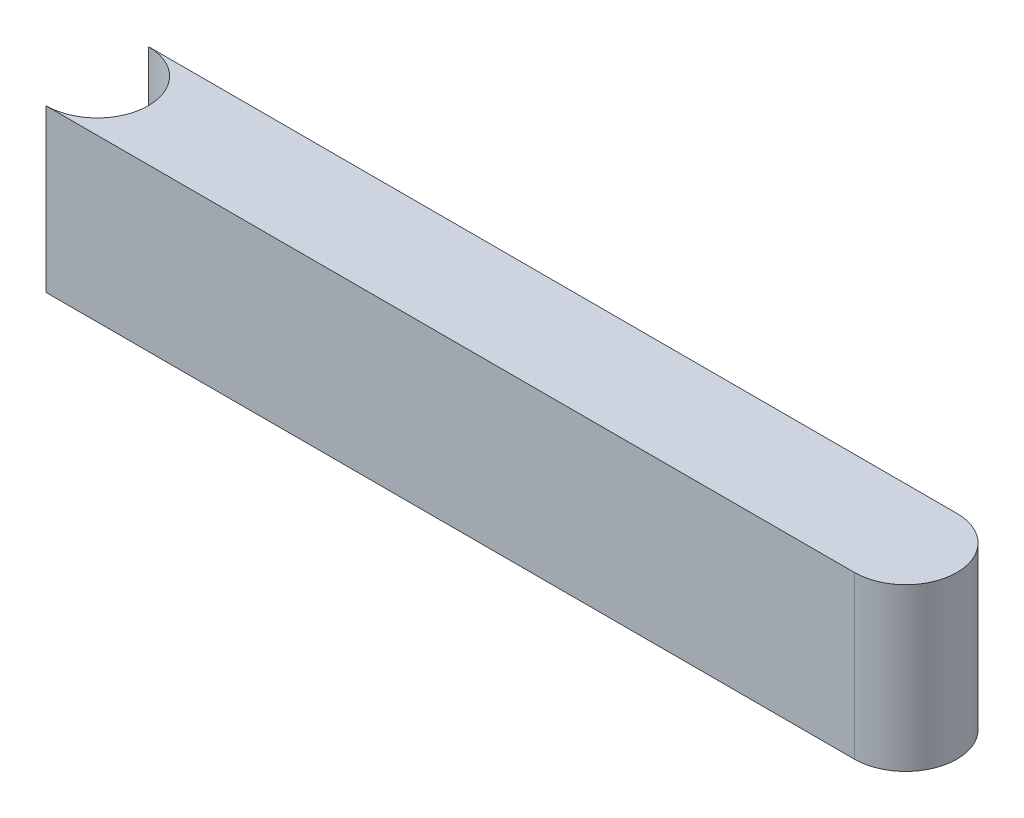
ISO-10303-21;
HEADER;
FILE_DESCRIPTION(('STEP AP214'),'2;1');
FILE_NAME('part.step','',(''),(''),'','','');
FILE_SCHEMA(('AUTOMOTIVE_DESIGN { 1 0 10303 214 1 1 1 1 }'));
ENDSEC;
DATA;
#1=APPLICATION_CONTEXT('core data for automotive mechanical design processes');
#2=APPLICATION_PROTOCOL_DEFINITION('international standard','automotive_design',2000,#1);
#3=PRODUCT_CONTEXT('',#1,'mechanical');
#4=PRODUCT('Part','Part','',(#3));
#5=PRODUCT_RELATED_PRODUCT_CATEGORY('part','',(#4));
#6=PRODUCT_DEFINITION_FORMATION('','',#4);
#7=PRODUCT_DEFINITION_CONTEXT('part definition',#1,'design');
#8=PRODUCT_DEFINITION('design','',#6,#7);
#9=PRODUCT_DEFINITION_SHAPE('','',#8);
#10=(LENGTH_UNIT() NAMED_UNIT(*) SI_UNIT(.MILLI.,.METRE.));
#11=(NAMED_UNIT(*) PLANE_ANGLE_UNIT() SI_UNIT($,.RADIAN.));
#12=(NAMED_UNIT(*) SI_UNIT($,.STERADIAN.) SOLID_ANGLE_UNIT());
#13=UNCERTAINTY_MEASURE_WITH_UNIT(LENGTH_MEASURE(1.E-05),#10,'distance_accuracy_value','');
#14=(GEOMETRIC_REPRESENTATION_CONTEXT(3) GLOBAL_UNCERTAINTY_ASSIGNED_CONTEXT((#13)) GLOBAL_UNIT_ASSIGNED_CONTEXT((#10,
#11,#12)) REPRESENTATION_CONTEXT('',''));
#15=CARTESIAN_POINT('',(0.,0.,0.));
#16=DIRECTION('',(0.,0.,1.));
#17=DIRECTION('',(1.,0.,0.));
#18=AXIS2_PLACEMENT_3D('',#15,#16,#17);
#19=CARTESIAN_POINT('',(0.,30.,9.5));
#20=DIRECTION('',(0.,-1.,0.));
#21=DIRECTION('',(0.,0.,-1.));
#22=AXIS2_PLACEMENT_3D('',#19,#20,#21);
#23=CYLINDRICAL_SURFACE('',#22,9.5);
#24=CARTESIAN_POINT('',(0.,0.,9.5));
#25=DIRECTION('',(0.,-1.,0.));
#26=DIRECTION('',(0.,0.,1.));
#27=AXIS2_PLACEMENT_3D('',#24,#25,#26);
#28=CIRCLE('',#27,9.5);
#29=CARTESIAN_POINT('',(0.,0.,0.));
#30=VERTEX_POINT('',#29);
#31=CARTESIAN_POINT('',(0.,0.,19.));
#32=VERTEX_POINT('',#31);
#33=EDGE_CURVE('E107',#30,#32,#28,.T.);
#34=ORIENTED_EDGE('',*,*,#33,.T.);
#35=DIRECTION('',(0.,-1.,0.));
#36=VECTOR('',#35,1.);
#37=CARTESIAN_POINT('',(0.,30.,19.));
#38=LINE('',#37,#36);
#39=CARTESIAN_POINT('',(0.,30.,19.));
#40=VERTEX_POINT('',#39);
#41=EDGE_CURVE('E11',#40,#32,#38,.T.);
#42=ORIENTED_EDGE('',*,*,#41,.F.);
#43=CARTESIAN_POINT('',(0.,30.,9.5));
#44=DIRECTION('',(0.,-1.,0.));
#45=DIRECTION('',(0.,0.,1.));
#46=AXIS2_PLACEMENT_3D('',#43,#44,#45);
#47=CIRCLE('',#46,9.5);
#48=CARTESIAN_POINT('',(0.,30.,0.));
#49=VERTEX_POINT('',#48);
#50=EDGE_CURVE('E91',#49,#40,#47,.T.);
#51=ORIENTED_EDGE('',*,*,#50,.F.);
#52=DIRECTION('',(0.,-1.,0.));
#53=VECTOR('',#52,1.);
#54=CARTESIAN_POINT('',(0.,30.,0.));
#55=LINE('',#54,#53);
#56=EDGE_CURVE('E103',#49,#30,#55,.T.);
#57=ORIENTED_EDGE('',*,*,#56,.T.);
#58=EDGE_LOOP('',(#34,#42,#51,#57));
#59=FACE_BOUND('',#58,.T.);
#60=ADVANCED_FACE('F39',(#59),#23,.F.);
#61=CARTESIAN_POINT('',(150.,30.,19.));
#62=DIRECTION('',(0.,0.,-1.));
#63=DIRECTION('',(-1.,0.,0.));
#64=AXIS2_PLACEMENT_3D('',#61,#62,#63);
#65=PLANE('',#64);
#66=DIRECTION('',(1.,0.,0.));
#67=VECTOR('',#66,1.);
#68=CARTESIAN_POINT('',(150.,0.,19.));
#69=LINE('',#68,#67);
#70=CARTESIAN_POINT('',(150.,0.,19.));
#71=VERTEX_POINT('',#70);
#72=EDGE_CURVE('E96',#32,#71,#69,.T.);
#73=ORIENTED_EDGE('',*,*,#72,.T.);
#74=DIRECTION('',(0.,-1.,0.));
#75=VECTOR('',#74,1.);
#76=CARTESIAN_POINT('',(150.,30.,19.));
#77=LINE('',#76,#75);
#78=CARTESIAN_POINT('',(150.,30.,19.));
#79=VERTEX_POINT('',#78);
#80=EDGE_CURVE('E48',#79,#71,#77,.T.);
#81=ORIENTED_EDGE('',*,*,#80,.F.);
#82=DIRECTION('',(1.,0.,0.));
#83=VECTOR('',#82,1.);
#84=CARTESIAN_POINT('',(150.,30.,19.));
#85=LINE('',#84,#83);
#86=EDGE_CURVE('E86',#40,#79,#85,.T.);
#87=ORIENTED_EDGE('',*,*,#86,.F.);
#88=ORIENTED_EDGE('',*,*,#41,.T.);
#89=EDGE_LOOP('',(#73,#81,#87,#88));
#90=FACE_BOUND('',#89,.T.);
#91=ADVANCED_FACE('F95',(#90),#65,.F.);
#92=CARTESIAN_POINT('',(150.,30.,9.5));
#93=DIRECTION('',(0.,-1.,0.));
#94=DIRECTION('',(0.,0.,-1.));
#95=AXIS2_PLACEMENT_3D('',#92,#93,#94);
#96=CYLINDRICAL_SURFACE('',#95,9.5);
#97=CARTESIAN_POINT('',(150.,0.,9.5));
#98=DIRECTION('',(0.,1.,0.));
#99=DIRECTION('',(0.,0.,-1.));
#100=AXIS2_PLACEMENT_3D('',#97,#98,#99);
#101=CIRCLE('',#100,9.5);
#102=CARTESIAN_POINT('',(150.,0.,0.));
#103=VERTEX_POINT('',#102);
#104=EDGE_CURVE('E73',#71,#103,#101,.T.);
#105=ORIENTED_EDGE('',*,*,#104,.T.);
#106=DIRECTION('',(0.,-1.,0.));
#107=VECTOR('',#106,1.);
#108=CARTESIAN_POINT('',(150.,30.,0.));
#109=LINE('',#108,#107);
#110=CARTESIAN_POINT('',(150.,30.,0.));
#111=VERTEX_POINT('',#110);
#112=EDGE_CURVE('E98',#111,#103,#109,.T.);
#113=ORIENTED_EDGE('',*,*,#112,.F.);
#114=CARTESIAN_POINT('',(150.,30.,9.5));
#115=DIRECTION('',(0.,1.,0.));
#116=DIRECTION('',(0.,0.,-1.));
#117=AXIS2_PLACEMENT_3D('',#114,#115,#116);
#118=CIRCLE('',#117,9.5);
#119=EDGE_CURVE('E89',#79,#111,#118,.T.);
#120=ORIENTED_EDGE('',*,*,#119,.F.);
#121=ORIENTED_EDGE('',*,*,#80,.T.);
#122=EDGE_LOOP('',(#105,#113,#120,#121));
#123=FACE_BOUND('',#122,.T.);
#124=ADVANCED_FACE('F99',(#123),#96,.T.);
#125=CARTESIAN_POINT('',(0.,30.,0.));
#126=DIRECTION('',(0.,0.,1.));
#127=DIRECTION('',(1.,0.,0.));
#128=AXIS2_PLACEMENT_3D('',#125,#126,#127);
#129=PLANE('',#128);
#130=DIRECTION('',(-1.,0.,0.));
#131=VECTOR('',#130,1.);
#132=CARTESIAN_POINT('',(0.,0.,0.));
#133=LINE('',#132,#131);
#134=EDGE_CURVE('E79',#103,#30,#133,.T.);
#135=ORIENTED_EDGE('',*,*,#134,.T.);
#136=ORIENTED_EDGE('',*,*,#56,.F.);
#137=DIRECTION('',(-1.,0.,0.));
#138=VECTOR('',#137,1.);
#139=CARTESIAN_POINT('',(0.,30.,0.));
#140=LINE('',#139,#138);
#141=EDGE_CURVE('E56',#111,#49,#140,.T.);
#142=ORIENTED_EDGE('',*,*,#141,.F.);
#143=ORIENTED_EDGE('',*,*,#112,.T.);
#144=EDGE_LOOP('',(#135,#136,#142,#143));
#145=FACE_BOUND('',#144,.T.);
#146=ADVANCED_FACE('F120',(#145),#129,.F.);
#147=CARTESIAN_POINT('',(0.,30.,9.5));
#148=DIRECTION('',(0.,1.,0.));
#149=DIRECTION('',(0.,0.,1.));
#150=AXIS2_PLACEMENT_3D('',#147,#148,#149);
#151=PLANE('',#150);
#152=ORIENTED_EDGE('',*,*,#50,.T.);
#153=ORIENTED_EDGE('',*,*,#86,.T.);
#154=ORIENTED_EDGE('',*,*,#119,.T.);
#155=ORIENTED_EDGE('',*,*,#141,.T.);
#156=EDGE_LOOP('',(#152,#153,#154,#155));
#157=FACE_BOUND('',#156,.T.);
#158=ADVANCED_FACE('F87',(#157),#151,.T.);
#159=CARTESIAN_POINT('',(0.,0.,9.5));
#160=DIRECTION('',(0.,1.,0.));
#161=DIRECTION('',(0.,0.,1.));
#162=AXIS2_PLACEMENT_3D('',#159,#160,#161);
#163=PLANE('',#162);
#164=ORIENTED_EDGE('',*,*,#33,.F.);
#165=ORIENTED_EDGE('',*,*,#134,.F.);
#166=ORIENTED_EDGE('',*,*,#104,.F.);
#167=ORIENTED_EDGE('',*,*,#72,.F.);
#168=EDGE_LOOP('',(#164,#165,#166,#167));
#169=FACE_BOUND('',#168,.T.);
#170=ADVANCED_FACE('F123',(#169),#163,.F.);
#171=CLOSED_SHELL('',(#60,#91,#124,#146,#158,#170));
#172=MANIFOLD_SOLID_BREP('B2',#171);
#173=ADVANCED_BREP_SHAPE_REPRESENTATION('',(#18,#172),#14);
#174=SHAPE_DEFINITION_REPRESENTATION(#9,#173);
ENDSEC;
END-ISO-10303-21;
